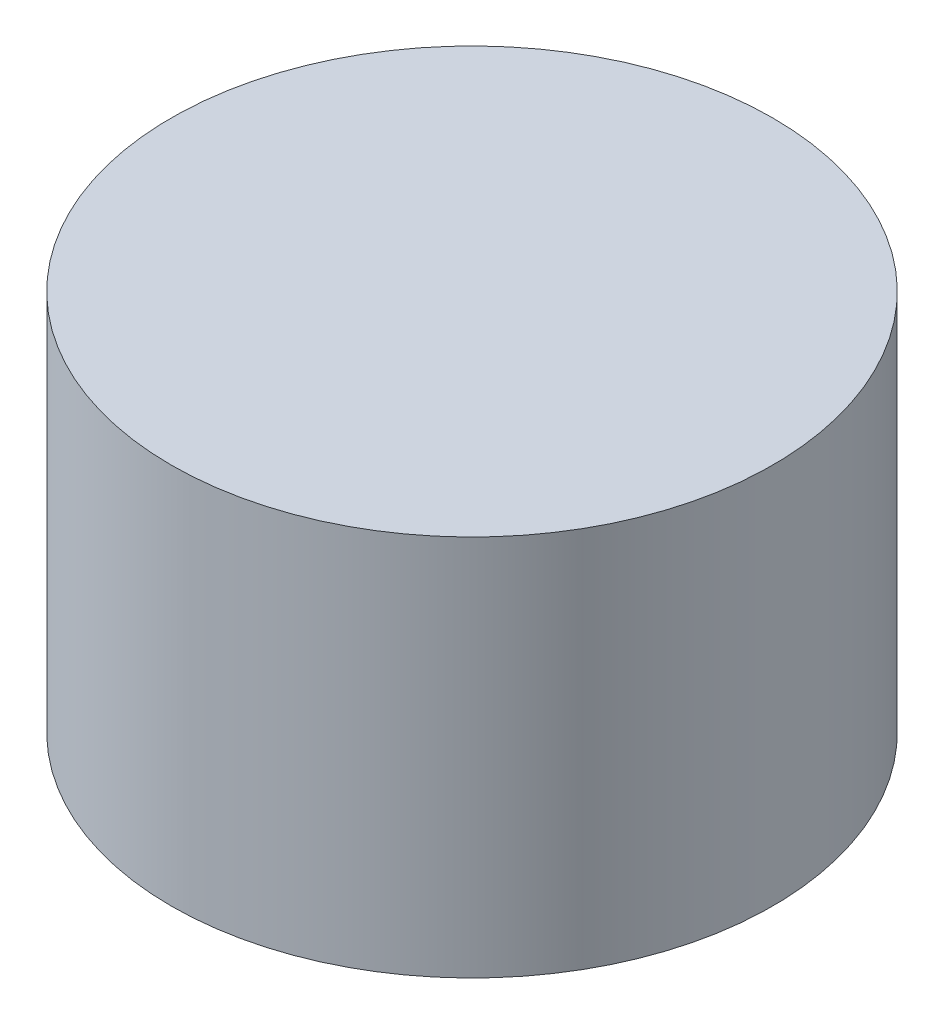
ISO-10303-21;
HEADER;
FILE_DESCRIPTION(('STEP AP214'),'2;1');
FILE_NAME('part.step','',(''),(''),'','','');
FILE_SCHEMA(('AUTOMOTIVE_DESIGN { 1 0 10303 214 1 1 1 1 }'));
ENDSEC;
DATA;
#1=APPLICATION_CONTEXT('core data for automotive mechanical design processes');
#2=APPLICATION_PROTOCOL_DEFINITION('international standard','automotive_design',2000,#1);
#3=PRODUCT_CONTEXT('',#1,'mechanical');
#4=PRODUCT('Part','Part','',(#3));
#5=PRODUCT_RELATED_PRODUCT_CATEGORY('part','',(#4));
#6=PRODUCT_DEFINITION_FORMATION('','',#4);
#7=PRODUCT_DEFINITION_CONTEXT('part definition',#1,'design');
#8=PRODUCT_DEFINITION('design','',#6,#7);
#9=PRODUCT_DEFINITION_SHAPE('','',#8);
#10=(LENGTH_UNIT() NAMED_UNIT(*) SI_UNIT(.MILLI.,.METRE.));
#11=(NAMED_UNIT(*) PLANE_ANGLE_UNIT() SI_UNIT($,.RADIAN.));
#12=(NAMED_UNIT(*) SI_UNIT($,.STERADIAN.) SOLID_ANGLE_UNIT());
#13=UNCERTAINTY_MEASURE_WITH_UNIT(LENGTH_MEASURE(1.E-05),#10,'distance_accuracy_value','');
#14=(GEOMETRIC_REPRESENTATION_CONTEXT(3) GLOBAL_UNCERTAINTY_ASSIGNED_CONTEXT((#13)) GLOBAL_UNIT_ASSIGNED_CONTEXT((#10,
#11,#12)) REPRESENTATION_CONTEXT('',''));
#15=CARTESIAN_POINT('',(0.,0.,0.));
#16=DIRECTION('',(0.,0.,1.));
#17=DIRECTION('',(1.,0.,0.));
#18=AXIS2_PLACEMENT_3D('',#15,#16,#17);
#19=CARTESIAN_POINT('',(0.,3.175,0.));
#20=DIRECTION('',(0.,-1.,0.));
#21=DIRECTION('',(0.,0.,-1.));
#22=AXIS2_PLACEMENT_3D('',#19,#20,#21);
#23=CYLINDRICAL_SURFACE('',#22,2.5);
#24=CARTESIAN_POINT('',(0.,3.175,0.));
#25=DIRECTION('',(0.,1.,0.));
#26=DIRECTION('',(0.,0.,1.));
#27=AXIS2_PLACEMENT_3D('',#24,#25,#26);
#28=CIRCLE('',#27,2.5);
#29=CARTESIAN_POINT('',(0.,3.175,2.5));
#30=VERTEX_POINT('',#29);
#31=EDGE_CURVE('E10',#30,#30,#28,.T.);
#32=ORIENTED_EDGE('',*,*,#31,.F.);
#33=EDGE_LOOP('',(#32));
#34=FACE_BOUND('',#33,.T.);
#35=CARTESIAN_POINT('',(0.,0.,0.));
#36=DIRECTION('',(0.,1.,0.));
#37=DIRECTION('',(0.,0.,1.));
#38=AXIS2_PLACEMENT_3D('',#35,#36,#37);
#39=CIRCLE('',#38,2.5);
#40=CARTESIAN_POINT('',(0.,0.,2.5));
#41=VERTEX_POINT('',#40);
#42=EDGE_CURVE('E34',#41,#41,#39,.T.);
#43=ORIENTED_EDGE('',*,*,#42,.T.);
#44=EDGE_LOOP('',(#43));
#45=FACE_BOUND('',#44,.T.);
#46=ADVANCED_FACE('F31',(#34,#45),#23,.T.);
#47=CARTESIAN_POINT('',(0.,3.175,0.));
#48=DIRECTION('',(0.,1.,0.));
#49=DIRECTION('',(0.,0.,1.));
#50=AXIS2_PLACEMENT_3D('',#47,#48,#49);
#51=PLANE('',#50);
#52=ORIENTED_EDGE('',*,*,#31,.T.);
#53=EDGE_LOOP('',(#52));
#54=FACE_BOUND('',#53,.T.);
#55=ADVANCED_FACE('F46',(#54),#51,.T.);
#56=CARTESIAN_POINT('',(0.,0.,0.));
#57=DIRECTION('',(0.,1.,0.));
#58=DIRECTION('',(0.,0.,1.));
#59=AXIS2_PLACEMENT_3D('',#56,#57,#58);
#60=PLANE('',#59);
#61=ORIENTED_EDGE('',*,*,#42,.F.);
#62=EDGE_LOOP('',(#61));
#63=FACE_BOUND('',#62,.T.);
#64=ADVANCED_FACE('F44',(#63),#60,.F.);
#65=CLOSED_SHELL('',(#46,#55,#64));
#66=MANIFOLD_SOLID_BREP('B2',#65);
#67=ADVANCED_BREP_SHAPE_REPRESENTATION('',(#18,#66),#14);
#68=SHAPE_DEFINITION_REPRESENTATION(#9,#67);
ENDSEC;
END-ISO-10303-21;
